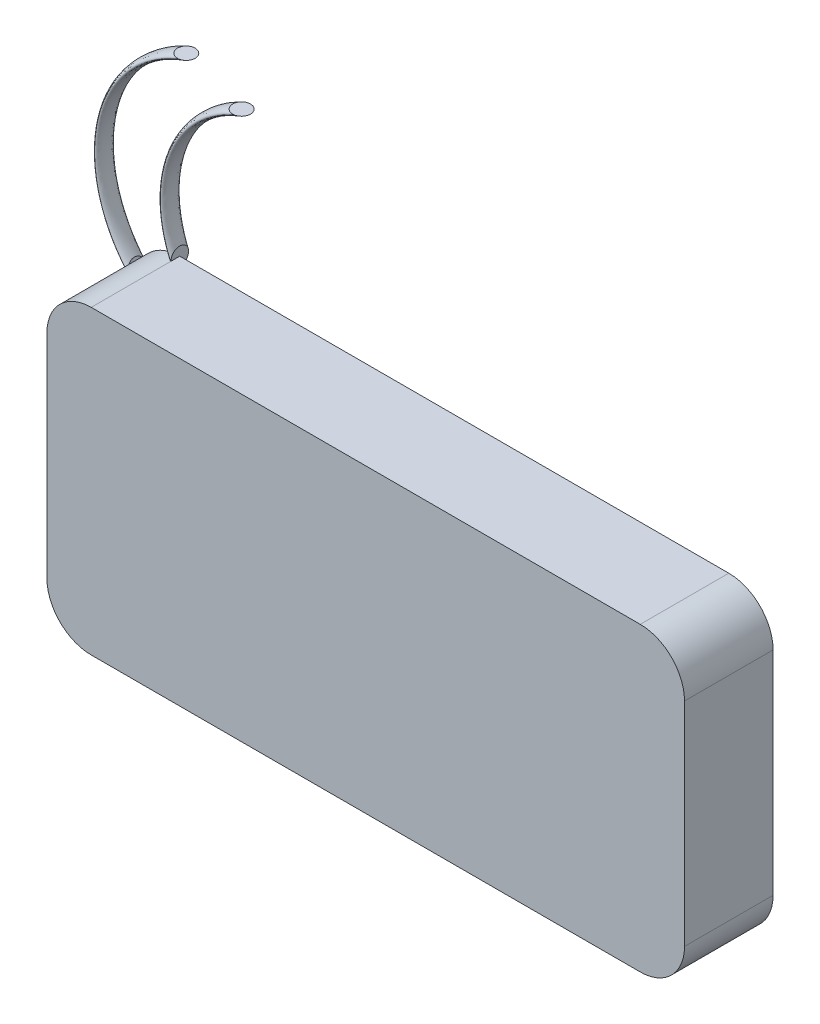
ISO-10303-21;
HEADER;
FILE_DESCRIPTION(('STEP AP214'),'2;1');
FILE_NAME('part.step','',(''),(''),'','','');
FILE_SCHEMA(('AUTOMOTIVE_DESIGN { 1 0 10303 214 1 1 1 1 }'));
ENDSEC;
DATA;
#1=APPLICATION_CONTEXT('core data for automotive mechanical design processes');
#2=APPLICATION_PROTOCOL_DEFINITION('international standard','automotive_design',2000,#1);
#3=PRODUCT_CONTEXT('',#1,'mechanical');
#4=PRODUCT('Part','Part','',(#3));
#5=PRODUCT_RELATED_PRODUCT_CATEGORY('part','',(#4));
#6=PRODUCT_DEFINITION_FORMATION('','',#4);
#7=PRODUCT_DEFINITION_CONTEXT('part definition',#1,'design');
#8=PRODUCT_DEFINITION('design','',#6,#7);
#9=PRODUCT_DEFINITION_SHAPE('','',#8);
#10=(LENGTH_UNIT() NAMED_UNIT(*) SI_UNIT(.MILLI.,.METRE.));
#11=(NAMED_UNIT(*) PLANE_ANGLE_UNIT() SI_UNIT($,.RADIAN.));
#12=(NAMED_UNIT(*) SI_UNIT($,.STERADIAN.) SOLID_ANGLE_UNIT());
#13=UNCERTAINTY_MEASURE_WITH_UNIT(LENGTH_MEASURE(1.E-05),#10,'distance_accuracy_value','');
#14=(GEOMETRIC_REPRESENTATION_CONTEXT(3) GLOBAL_UNCERTAINTY_ASSIGNED_CONTEXT((#13)) GLOBAL_UNIT_ASSIGNED_CONTEXT((#10,
#11,#12)) REPRESENTATION_CONTEXT('',''));
#15=CARTESIAN_POINT('',(0.,0.,0.));
#16=DIRECTION('',(0.,0.,1.));
#17=DIRECTION('',(1.,0.,0.));
#18=AXIS2_PLACEMENT_3D('',#15,#16,#17);
#19=CARTESIAN_POINT('',(67.,5.,0.));
#20=DIRECTION('',(0.,0.,1.));
#21=DIRECTION('',(1.,0.,0.));
#22=AXIS2_PLACEMENT_3D('',#19,#20,#21);
#23=PLANE('',#22);
#24=DIRECTION('',(0.,-1.,0.));
#25=VECTOR('',#24,1.);
#26=CARTESIAN_POINT('',(4.99999999999998,5.0000000000001,0.));
#27=LINE('',#26,#25);
#28=CARTESIAN_POINT('',(5.00000000000002,34.,0.));
#29=VERTEX_POINT('',#28);
#30=CARTESIAN_POINT('',(5.00000000000003,33.0008996980429,0.));
#31=VERTEX_POINT('',#30);
#32=EDGE_CURVE('E128',#29,#31,#27,.T.);
#33=ORIENTED_EDGE('',*,*,#32,.F.);
#34=DIRECTION('',(-1.,0.,0.));
#35=VECTOR('',#34,1.);
#36=CARTESIAN_POINT('',(5.00000000000004,34.,0.));
#37=LINE('',#36,#35);
#38=CARTESIAN_POINT('',(67.,34.,0.));
#39=VERTEX_POINT('',#38);
#40=EDGE_CURVE('E218',#39,#29,#37,.T.);
#41=ORIENTED_EDGE('',*,*,#40,.F.);
#42=CARTESIAN_POINT('',(67.,29.,0.));
#43=DIRECTION('',(0.,0.,1.));
#44=DIRECTION('',(-1.,0.,0.));
#45=AXIS2_PLACEMENT_3D('',#42,#43,#44);
#46=CIRCLE('',#45,5.);
#47=CARTESIAN_POINT('',(72.,29.,0.));
#48=VERTEX_POINT('',#47);
#49=EDGE_CURVE('E216',#48,#39,#46,.T.);
#50=ORIENTED_EDGE('',*,*,#49,.F.);
#51=DIRECTION('',(0.,1.,0.));
#52=VECTOR('',#51,1.);
#53=CARTESIAN_POINT('',(72.,5.00000000000004,0.));
#54=LINE('',#53,#52);
#55=CARTESIAN_POINT('',(72.,5.00000000000004,0.));
#56=VERTEX_POINT('',#55);
#57=EDGE_CURVE('E214',#56,#48,#54,.T.);
#58=ORIENTED_EDGE('',*,*,#57,.F.);
#59=CARTESIAN_POINT('',(67.,5.,0.));
#60=DIRECTION('',(0.,0.,1.));
#61=DIRECTION('',(1.,0.,0.));
#62=AXIS2_PLACEMENT_3D('',#59,#60,#61);
#63=CIRCLE('',#62,5.);
#64=CARTESIAN_POINT('',(67.,0.,0.));
#65=VERTEX_POINT('',#64);
#66=EDGE_CURVE('E192',#65,#56,#63,.T.);
#67=ORIENTED_EDGE('',*,*,#66,.F.);
#68=DIRECTION('',(1.,0.,0.));
#69=VECTOR('',#68,1.);
#70=CARTESIAN_POINT('',(5.00000000000004,0.,0.));
#71=LINE('',#70,#69);
#72=CARTESIAN_POINT('',(5.00000000000004,0.,0.));
#73=VERTEX_POINT('',#72);
#74=EDGE_CURVE('E197',#73,#65,#71,.T.);
#75=ORIENTED_EDGE('',*,*,#74,.F.);
#76=CARTESIAN_POINT('',(5.,5.,0.));
#77=DIRECTION('',(0.,0.,1.));
#78=DIRECTION('',(-1.,0.,0.));
#79=AXIS2_PLACEMENT_3D('',#76,#77,#78);
#80=CIRCLE('',#79,5.);
#81=CARTESIAN_POINT('',(0.,5.,0.));
#82=VERTEX_POINT('',#81);
#83=EDGE_CURVE('E225',#82,#73,#80,.T.);
#84=ORIENTED_EDGE('',*,*,#83,.F.);
#85=DIRECTION('',(0.,-1.,0.));
#86=VECTOR('',#85,1.);
#87=CARTESIAN_POINT('',(0.,5.00000000000004,0.));
#88=LINE('',#87,#86);
#89=CARTESIAN_POINT('',(0.,29.,0.));
#90=VERTEX_POINT('',#89);
#91=EDGE_CURVE('E223',#90,#82,#88,.T.);
#92=ORIENTED_EDGE('',*,*,#91,.F.);
#93=CARTESIAN_POINT('',(5.,29.,0.));
#94=DIRECTION('',(0.,0.,1.));
#95=DIRECTION('',(-1.,0.,0.));
#96=AXIS2_PLACEMENT_3D('',#93,#94,#95);
#97=CIRCLE('',#96,5.);
#98=CARTESIAN_POINT('',(0.0884421930118107,29.936269143256,0.));
#99=VERTEX_POINT('',#98);
#100=EDGE_CURVE('E220',#99,#90,#97,.T.);
#101=ORIENTED_EDGE('',*,*,#100,.F.);
#102=CARTESIAN_POINT('',(11.4249652949208,40.3526080949867,0.));
#103=DIRECTION('',(0.,0.,-1.));
#104=DIRECTION('',(-1.,0.,0.));
#105=AXIS2_PLACEMENT_3D('',#102,#103,#104);
#106=CIRCLE('',#105,15.395352324564);
#107=CARTESIAN_POINT('',(0.536435096106281,29.4688227559164,0.));
#108=VERTEX_POINT('',#107);
#109=EDGE_CURVE('E251',#99,#108,#106,.F.);
#110=ORIENTED_EDGE('',*,*,#109,.T.);
#111=DIRECTION('',(0.329385674954693,-0.944195465533828,0.));
#112=VECTOR('',#111,1.);
#113=CARTESIAN_POINT('',(15.357307468977,-13.0157221218928,0.));
#114=LINE('',#113,#112);
#115=CARTESIAN_POINT('',(0.205298062716035,30.4180385511704,0.));
#116=VERTEX_POINT('',#115);
#117=EDGE_CURVE('E42',#116,#108,#114,.T.);
#118=ORIENTED_EDGE('',*,*,#117,.F.);
#119=CARTESIAN_POINT('',(4.53985029390734,33.9787812010554,0.));
#120=VERTEX_POINT('',#119);
#121=EDGE_CURVE('E221',#120,#116,#97,.T.);
#122=ORIENTED_EDGE('',*,*,#121,.F.);
#123=CARTESIAN_POINT('',(17.4354198997295,39.4496869852021,0.));
#124=DIRECTION('',(0.,0.,-1.));
#125=DIRECTION('',(-1.,0.,0.));
#126=AXIS2_PLACEMENT_3D('',#123,#124,#125);
#127=CIRCLE('',#126,14.0080878622892);
#128=EDGE_CURVE('E11',#120,#31,#127,.F.);
#129=ORIENTED_EDGE('',*,*,#128,.T.);
#130=EDGE_LOOP('',(#33,#41,#50,#58,#67,#75,#84,#92,#101,#110,#118,#122,#129));
#131=FACE_BOUND('',#130,.T.);
#132=ADVANCED_FACE('F34',(#131),#23,.F.);
#133=CARTESIAN_POINT('',(5.,29.,10.));
#134=DIRECTION('',(0.,0.,-1.));
#135=DIRECTION('',(-1.,0.,0.));
#136=AXIS2_PLACEMENT_3D('',#133,#134,#135);
#137=CYLINDRICAL_SURFACE('',#136,5.);
#138=DIRECTION('',(0.,0.,-1.));
#139=VECTOR('',#138,1.);
#140=CARTESIAN_POINT('',(5.00000000000004,34.,10.));
#141=LINE('',#140,#139);
#142=CARTESIAN_POINT('',(5.00000000000004,34.,10.));
#143=VERTEX_POINT('',#142);
#144=CARTESIAN_POINT('',(5.00000000000004,34.,0.999100301957087));
#145=VERTEX_POINT('',#144);
#146=EDGE_CURVE('E240',#143,#145,#141,.T.);
#147=ORIENTED_EDGE('',*,*,#146,.T.);
#148=CARTESIAN_POINT('',(5.00000000000003,34.,0.999100301957087));
#149=CARTESIAN_POINT('',(4.98607693705951,34.0000021979118,0.999142509095301));
#150=CARTESIAN_POINT('',(4.9722461072335,33.9999419381843,0.997587468870882));
#151=CARTESIAN_POINT('',(4.94530139066627,33.9997181434536,0.991826125624204));
#152=CARTESIAN_POINT('',(4.93218108586637,33.9995558046997,0.987650533549538));
#153=CARTESIAN_POINT('',(4.90457269351783,33.999111950049,0.976225251962453));
#154=CARTESIAN_POINT('',(4.89026353443802,33.9988142414723,0.968557499354267));
#155=CARTESIAN_POINT('',(4.86295259517132,33.9981401808719,0.951065986251289));
#156=CARTESIAN_POINT('',(4.8499595948591,33.9977633464463,0.941228981222202));
#157=CARTESIAN_POINT('',(4.81662993085964,33.9966808571331,0.912633323827443));
#158=CARTESIAN_POINT('',(4.79752769111054,33.9959298311245,0.892453417487748));
#159=CARTESIAN_POINT('',(4.76241789375922,33.9943830822246,0.849618542609901));
#160=CARTESIAN_POINT('',(4.7464159572,33.9935872814618,0.826959192906528));
#161=CARTESIAN_POINT('',(4.7170189534145,33.9920072388262,0.780237358050385));
#162=CARTESIAN_POINT('',(4.70360732091259,33.9912229553052,0.756185161141288));
#163=CARTESIAN_POINT('',(4.67884413056725,33.9896905195244,0.707033482740123));
#164=CARTESIAN_POINT('',(4.66749452976227,33.9889424020783,0.681933033864363));
#165=CARTESIAN_POINT('',(4.63607037935507,33.9867829615147,0.605506452006262));
#166=CARTESIAN_POINT('',(4.61863819630192,33.9854576062808,0.553085485135301));
#167=CARTESIAN_POINT('',(4.59295722807165,33.983415723985,0.459690693614689));
#168=CARTESIAN_POINT('',(4.58350638317862,33.982629505088,0.41902761991427));
#169=CARTESIAN_POINT('',(4.56748772421334,33.9812647635938,0.337121149308805));
#170=CARTESIAN_POINT('',(4.56092052753164,33.9806862854789,0.295877630078912));
#171=CARTESIAN_POINT('',(4.5503546227513,33.9797438350477,0.212305281396447));
#172=CARTESIAN_POINT('',(4.54640479692173,33.9793839550344,0.169970354950818));
#173=CARTESIAN_POINT('',(4.54115874756467,33.9789020270681,0.0850885473157945));
#174=CARTESIAN_POINT('',(4.53986535632076,33.9787802329684,0.0425414883333917));
#175=CARTESIAN_POINT('',(4.53985029390735,33.9787812010554,0.));
#176=B_SPLINE_CURVE_WITH_KNOTS('',3,(#148,#149,#150,#151,#152,#153,#154,#155,#156,#157,#158,
#159,#160,#161,#162,#163,#164,#165,#166,#167,#168,#169,#170,#171,#172,#173,#174,#175),
.UNSPECIFIED.,.F.,.F.,(4,2,2,2,2,2,2,2,2,2,2,2,2,4),(0.,0.0415393318644265,0.0826007176007306,
0.131053538073427,0.179810811838929,0.262735983320194,0.345810124517231,0.428334000080407,
0.510935793076548,0.676243982118326,0.801417648472979,0.926618101522078,1.05409543943348,
1.18170862293958),.UNSPECIFIED.);
#177=EDGE_CURVE('E55',#145,#120,#176,.T.);
#178=ORIENTED_EDGE('',*,*,#177,.T.);
#179=ORIENTED_EDGE('',*,*,#121,.T.);
#180=DIRECTION('',(0.,0.,-1.));
#181=VECTOR('',#180,1.);
#182=CARTESIAN_POINT('',(0.205298062716033,30.4180385511704,10.));
#183=LINE('',#182,#181);
#184=CARTESIAN_POINT('',(0.205298062716034,30.4180385511704,0.999985864416658));
#185=VERTEX_POINT('',#184);
#186=EDGE_CURVE('E188',#185,#116,#183,.T.);
#187=ORIENTED_EDGE('',*,*,#186,.F.);
#188=CARTESIAN_POINT('',(0.205298062716034,30.4180385511704,0.999985864416658));
#189=CARTESIAN_POINT('',(0.201800323069069,30.406216699392,1.00015543326696));
#190=CARTESIAN_POINT('',(0.198360006613919,30.3944188532153,0.99913881190872));
#191=CARTESIAN_POINT('',(0.19169597642804,30.3712593811186,0.995076103396521));
#192=CARTESIAN_POINT('',(0.188470213695762,30.3598942833473,0.992053684921513));
#193=CARTESIAN_POINT('',(0.181178821143054,30.3338683518481,0.982973485351146));
#194=CARTESIAN_POINT('',(0.177208181074048,30.3194258362253,0.976227702645713));
#195=CARTESIAN_POINT('',(0.169696566450536,30.2916567086538,0.960456663808333));
#196=CARTESIAN_POINT('',(0.166158206369834,30.2783370246905,0.951418465303915));
#197=CARTESIAN_POINT('',(0.157277724735583,30.2443968367932,0.925168758612041));
#198=CARTESIAN_POINT('',(0.152299406338456,30.224806393504,0.90651699995717));
#199=CARTESIAN_POINT('',(0.143248236628929,30.1884081532512,0.866531781949044));
#200=CARTESIAN_POINT('',(0.139177073865918,30.1716055600972,0.84519343547471));
#201=CARTESIAN_POINT('',(0.131924248943343,30.1410836107701,0.801829562166138));
#202=CARTESIAN_POINT('',(0.128709497724821,30.1272556426633,0.779884947157588));
#203=CARTESIAN_POINT('',(0.122804788425935,30.1014269923445,0.734869425856259));
#204=CARTESIAN_POINT('',(0.120115305968979,30.0894279683537,0.711797522231154));
#205=CARTESIAN_POINT('',(0.112694703125694,30.0558315576542,0.641328629713969));
#206=CARTESIAN_POINT('',(0.108615273446885,30.0366514279931,0.592703611949023));
#207=CARTESIAN_POINT('',(0.102198986942487,30.0058591318511,0.500156799078394));
#208=CARTESIAN_POINT('',(0.0997036460048645,29.9935839045421,0.456455900080183));
#209=CARTESIAN_POINT('',(0.0955216663247193,29.9727307509741,0.368211520459611));
#210=CARTESIAN_POINT('',(0.0938338461140916,29.9641474250347,0.323669370524737));
#211=CARTESIAN_POINT('',(0.0911166732861291,29.9502203210285,0.232766050672841));
#212=CARTESIAN_POINT('',(0.0901075136619822,29.9449761172663,0.18638927144711));
#213=CARTESIAN_POINT('',(0.0887738557529616,29.9380079063555,0.0933385578658275));
#214=CARTESIAN_POINT('',(0.0884496777452376,29.9362855459288,0.0466644947345476));
#215=CARTESIAN_POINT('',(0.0884421930118176,29.936269143256,2.93266029395825E-12));
#216=B_SPLINE_CURVE_WITH_KNOTS('',3,(#188,#189,#190,#191,#192,#193,#194,#195,#196,#197,#198,
#199,#200,#201,#202,#203,#204,#205,#206,#207,#208,#209,#210,#211,#212,#213,#214,#215),
.UNSPECIFIED.,.F.,.F.,(4,2,2,2,2,2,2,2,2,2,2,2,2,4),(0.,0.0368508597721053,0.0732744276436689,
0.122285057488083,0.17157879917652,0.253628291621686,0.335829255641276,0.414121855998176,
0.492485023818365,0.649301587188467,0.785525238998852,0.921548970447638,1.06145942233062,
1.20143527774106),.UNSPECIFIED.);
#217=EDGE_CURVE('E181',#185,#99,#216,.T.);
#218=ORIENTED_EDGE('',*,*,#217,.T.);
#219=ORIENTED_EDGE('',*,*,#100,.T.);
#220=DIRECTION('',(0.,0.,-1.));
#221=VECTOR('',#220,1.);
#222=CARTESIAN_POINT('',(0.,29.,10.));
#223=LINE('',#222,#221);
#224=CARTESIAN_POINT('',(0.,29.,10.));
#225=VERTEX_POINT('',#224);
#226=EDGE_CURVE('E236',#225,#90,#223,.T.);
#227=ORIENTED_EDGE('',*,*,#226,.F.);
#228=CARTESIAN_POINT('',(5.,29.,10.));
#229=DIRECTION('',(0.,0.,1.));
#230=DIRECTION('',(-1.,0.,0.));
#231=AXIS2_PLACEMENT_3D('',#228,#229,#230);
#232=CIRCLE('',#231,5.);
#233=EDGE_CURVE('E203',#143,#225,#232,.T.);
#234=ORIENTED_EDGE('',*,*,#233,.F.);
#235=EDGE_LOOP('',(#147,#178,#179,#187,#218,#219,#227,#234));
#236=FACE_BOUND('',#235,.T.);
#237=ADVANCED_FACE('F144',(#236),#137,.T.);
#238=CARTESIAN_POINT('',(67.,5.,10.));
#239=DIRECTION('',(0.,0.,-1.));
#240=DIRECTION('',(-1.,0.,0.));
#241=AXIS2_PLACEMENT_3D('',#238,#239,#240);
#242=CYLINDRICAL_SURFACE('',#241,5.);
#243=ORIENTED_EDGE('',*,*,#66,.T.);
#244=DIRECTION('',(0.,0.,-1.));
#245=VECTOR('',#244,1.);
#246=CARTESIAN_POINT('',(72.,5.00000000000004,10.));
#247=LINE('',#246,#245);
#248=CARTESIAN_POINT('',(72.,5.00000000000004,10.));
#249=VERTEX_POINT('',#248);
#250=EDGE_CURVE('E248',#249,#56,#247,.T.);
#251=ORIENTED_EDGE('',*,*,#250,.F.);
#252=CARTESIAN_POINT('',(67.,5.,10.));
#253=DIRECTION('',(0.,0.,1.));
#254=DIRECTION('',(1.,0.,0.));
#255=AXIS2_PLACEMENT_3D('',#252,#253,#254);
#256=CIRCLE('',#255,5.);
#257=CARTESIAN_POINT('',(67.,0.,10.));
#258=VERTEX_POINT('',#257);
#259=EDGE_CURVE('E193',#258,#249,#256,.T.);
#260=ORIENTED_EDGE('',*,*,#259,.F.);
#261=DIRECTION('',(0.,0.,-1.));
#262=VECTOR('',#261,1.);
#263=CARTESIAN_POINT('',(67.,0.,10.));
#264=LINE('',#263,#262);
#265=EDGE_CURVE('E211',#258,#65,#264,.T.);
#266=ORIENTED_EDGE('',*,*,#265,.T.);
#267=EDGE_LOOP('',(#243,#251,#260,#266));
#268=FACE_BOUND('',#267,.T.);
#269=ADVANCED_FACE('F36',(#268),#242,.T.);
#270=CARTESIAN_POINT('',(72.,5.00000000000004,10.));
#271=DIRECTION('',(-1.,0.,0.));
#272=DIRECTION('',(0.,0.,1.));
#273=AXIS2_PLACEMENT_3D('',#270,#271,#272);
#274=PLANE('',#273);
#275=ORIENTED_EDGE('',*,*,#57,.T.);
#276=DIRECTION('',(0.,0.,-1.));
#277=VECTOR('',#276,1.);
#278=CARTESIAN_POINT('',(72.,29.,10.));
#279=LINE('',#278,#277);
#280=CARTESIAN_POINT('',(72.,29.,10.));
#281=VERTEX_POINT('',#280);
#282=EDGE_CURVE('E245',#281,#48,#279,.T.);
#283=ORIENTED_EDGE('',*,*,#282,.F.);
#284=DIRECTION('',(0.,1.,0.));
#285=VECTOR('',#284,1.);
#286=CARTESIAN_POINT('',(72.,5.00000000000004,10.));
#287=LINE('',#286,#285);
#288=EDGE_CURVE('E196',#249,#281,#287,.T.);
#289=ORIENTED_EDGE('',*,*,#288,.F.);
#290=ORIENTED_EDGE('',*,*,#250,.T.);
#291=EDGE_LOOP('',(#275,#283,#289,#290));
#292=FACE_BOUND('',#291,.T.);
#293=ADVANCED_FACE('F277',(#292),#274,.F.);
#294=CARTESIAN_POINT('',(67.,29.,10.));
#295=DIRECTION('',(0.,0.,-1.));
#296=DIRECTION('',(-1.,0.,0.));
#297=AXIS2_PLACEMENT_3D('',#294,#295,#296);
#298=CYLINDRICAL_SURFACE('',#297,5.);
#299=ORIENTED_EDGE('',*,*,#49,.T.);
#300=DIRECTION('',(0.,0.,-1.));
#301=VECTOR('',#300,1.);
#302=CARTESIAN_POINT('',(67.,34.,10.));
#303=LINE('',#302,#301);
#304=CARTESIAN_POINT('',(67.,34.,10.));
#305=VERTEX_POINT('',#304);
#306=EDGE_CURVE('E242',#305,#39,#303,.T.);
#307=ORIENTED_EDGE('',*,*,#306,.F.);
#308=CARTESIAN_POINT('',(67.,29.,10.));
#309=DIRECTION('',(0.,0.,1.));
#310=DIRECTION('',(-1.,0.,0.));
#311=AXIS2_PLACEMENT_3D('',#308,#309,#310);
#312=CIRCLE('',#311,5.);
#313=EDGE_CURVE('E199',#281,#305,#312,.T.);
#314=ORIENTED_EDGE('',*,*,#313,.F.);
#315=ORIENTED_EDGE('',*,*,#282,.T.);
#316=EDGE_LOOP('',(#299,#307,#314,#315));
#317=FACE_BOUND('',#316,.T.);
#318=ADVANCED_FACE('F274',(#317),#298,.T.);
#319=CARTESIAN_POINT('',(5.00000000000004,34.,10.));
#320=DIRECTION('',(0.,-1.,0.));
#321=DIRECTION('',(0.,0.,-1.));
#322=AXIS2_PLACEMENT_3D('',#319,#320,#321);
#323=PLANE('',#322);
#324=ORIENTED_EDGE('',*,*,#40,.T.);
#325=EDGE_CURVE('E239',#145,#29,#141,.T.);
#326=ORIENTED_EDGE('',*,*,#325,.F.);
#327=ORIENTED_EDGE('',*,*,#146,.F.);
#328=DIRECTION('',(-1.,0.,0.));
#329=VECTOR('',#328,1.);
#330=CARTESIAN_POINT('',(5.00000000000004,34.,10.));
#331=LINE('',#330,#329);
#332=EDGE_CURVE('E201',#305,#143,#331,.T.);
#333=ORIENTED_EDGE('',*,*,#332,.F.);
#334=ORIENTED_EDGE('',*,*,#306,.T.);
#335=EDGE_LOOP('',(#324,#326,#327,#333,#334));
#336=FACE_BOUND('',#335,.T.);
#337=ADVANCED_FACE('F268',(#336),#323,.F.);
#338=CARTESIAN_POINT('',(0.,5.00000000000004,10.));
#339=DIRECTION('',(1.,0.,0.));
#340=DIRECTION('',(0.,0.,-1.));
#341=AXIS2_PLACEMENT_3D('',#338,#339,#340);
#342=PLANE('',#341);
#343=ORIENTED_EDGE('',*,*,#91,.T.);
#344=DIRECTION('',(0.,0.,-1.));
#345=VECTOR('',#344,1.);
#346=CARTESIAN_POINT('',(0.,5.,10.));
#347=LINE('',#346,#345);
#348=CARTESIAN_POINT('',(0.,5.,10.));
#349=VERTEX_POINT('',#348);
#350=EDGE_CURVE('E233',#349,#82,#347,.T.);
#351=ORIENTED_EDGE('',*,*,#350,.F.);
#352=DIRECTION('',(0.,-1.,0.));
#353=VECTOR('',#352,1.);
#354=CARTESIAN_POINT('',(0.,5.00000000000004,10.));
#355=LINE('',#354,#353);
#356=EDGE_CURVE('E205',#225,#349,#355,.T.);
#357=ORIENTED_EDGE('',*,*,#356,.F.);
#358=ORIENTED_EDGE('',*,*,#226,.T.);
#359=EDGE_LOOP('',(#343,#351,#357,#358));
#360=FACE_BOUND('',#359,.T.);
#361=ADVANCED_FACE('F294',(#360),#342,.F.);
#362=CARTESIAN_POINT('',(5.,5.,10.));
#363=DIRECTION('',(0.,0.,-1.));
#364=DIRECTION('',(-1.,0.,0.));
#365=AXIS2_PLACEMENT_3D('',#362,#363,#364);
#366=CYLINDRICAL_SURFACE('',#365,5.);
#367=ORIENTED_EDGE('',*,*,#83,.T.);
#368=DIRECTION('',(0.,0.,-1.));
#369=VECTOR('',#368,1.);
#370=CARTESIAN_POINT('',(5.00000000000004,0.,10.));
#371=LINE('',#370,#369);
#372=CARTESIAN_POINT('',(5.00000000000004,0.,10.));
#373=VERTEX_POINT('',#372);
#374=EDGE_CURVE('E230',#373,#73,#371,.T.);
#375=ORIENTED_EDGE('',*,*,#374,.F.);
#376=CARTESIAN_POINT('',(5.,5.,10.));
#377=DIRECTION('',(0.,0.,1.));
#378=DIRECTION('',(-1.,0.,0.));
#379=AXIS2_PLACEMENT_3D('',#376,#377,#378);
#380=CIRCLE('',#379,5.);
#381=EDGE_CURVE('E207',#349,#373,#380,.T.);
#382=ORIENTED_EDGE('',*,*,#381,.F.);
#383=ORIENTED_EDGE('',*,*,#350,.T.);
#384=EDGE_LOOP('',(#367,#375,#382,#383));
#385=FACE_BOUND('',#384,.T.);
#386=ADVANCED_FACE('F291',(#385),#366,.T.);
#387=CARTESIAN_POINT('',(5.00000000000004,0.,10.));
#388=DIRECTION('',(0.,1.,0.));
#389=DIRECTION('',(0.,0.,1.));
#390=AXIS2_PLACEMENT_3D('',#387,#388,#389);
#391=PLANE('',#390);
#392=ORIENTED_EDGE('',*,*,#74,.T.);
#393=ORIENTED_EDGE('',*,*,#265,.F.);
#394=DIRECTION('',(1.,0.,0.));
#395=VECTOR('',#394,1.);
#396=CARTESIAN_POINT('',(5.00000000000004,0.,10.));
#397=LINE('',#396,#395);
#398=EDGE_CURVE('E209',#373,#258,#397,.T.);
#399=ORIENTED_EDGE('',*,*,#398,.F.);
#400=ORIENTED_EDGE('',*,*,#374,.T.);
#401=EDGE_LOOP('',(#392,#393,#399,#400));
#402=FACE_BOUND('',#401,.T.);
#403=ADVANCED_FACE('F287',(#402),#391,.F.);
#404=CARTESIAN_POINT('',(67.,5.,10.));
#405=DIRECTION('',(0.,0.,1.));
#406=DIRECTION('',(1.,0.,0.));
#407=AXIS2_PLACEMENT_3D('',#404,#405,#406);
#408=PLANE('',#407);
#409=ORIENTED_EDGE('',*,*,#259,.T.);
#410=ORIENTED_EDGE('',*,*,#288,.T.);
#411=ORIENTED_EDGE('',*,*,#313,.T.);
#412=ORIENTED_EDGE('',*,*,#332,.T.);
#413=ORIENTED_EDGE('',*,*,#233,.T.);
#414=ORIENTED_EDGE('',*,*,#356,.T.);
#415=ORIENTED_EDGE('',*,*,#381,.T.);
#416=ORIENTED_EDGE('',*,*,#398,.T.);
#417=EDGE_LOOP('',(#409,#410,#411,#412,#413,#414,#415,#416));
#418=FACE_BOUND('',#417,.T.);
#419=ADVANCED_FACE('F298',(#418),#408,.T.);
#420=CARTESIAN_POINT('',(0.207049421151587,30.4130182214502,0.));
#421=DIRECTION('',(-0.944195465533828,-0.329385674954693,0.));
#422=DIRECTION('',(0.,0.,1.));
#423=AXIS2_PLACEMENT_3D('',#420,#421,#422);
#424=PLANE('',#423);
#425=CARTESIAN_POINT('',(0.207049421151587,30.4130182214502,0.));
#426=DIRECTION('',(-0.944195465533828,-0.329385674954693,0.));
#427=DIRECTION('',(0.,0.,1.));
#428=AXIS2_PLACEMENT_3D('',#425,#426,#427);
#429=CIRCLE('',#428,1.);
#430=EDGE_CURVE('E142',#185,#108,#429,.T.);
#431=ORIENTED_EDGE('',*,*,#430,.F.);
#432=ORIENTED_EDGE('',*,*,#186,.T.);
#433=ORIENTED_EDGE('',*,*,#117,.T.);
#434=EDGE_LOOP('',(#431,#432,#433));
#435=FACE_BOUND('',#434,.T.);
#436=ADVANCED_FACE('F172',(#435),#424,.F.);
#437=CARTESIAN_POINT('',(0.207049421151587,30.4130182214502,1.));
#438=CARTESIAN_POINT('',(-7.30285698852021,38.8887701785684,1.));
#439=CARTESIAN_POINT('',(-4.74135175776854,49.9194436155556,1.));
#440=CARTESIAN_POINT('',(5.73507039872823,54.2184719150072,1.));
#441=CARTESIAN_POINT('',(-0.451721928757802,32.3014091525179,1.));
#442=CARTESIAN_POINT('',(-6.5348452077746,41.274899069264,1.));
#443=CARTESIAN_POINT('',(-2.74135175776855,51.4305535316028,1.));
#444=CARTESIAN_POINT('',(7.73507039872823,54.2184719150072,1.));
#445=CARTESIAN_POINT('',(-0.451721928757802,32.3014091525179,-1.));
#446=CARTESIAN_POINT('',(-6.5348452077746,41.274899069264,-1.));
#447=CARTESIAN_POINT('',(-2.74135175776855,51.4305535316028,-1.));
#448=CARTESIAN_POINT('',(7.73507039872823,54.2184719150072,-1.));
#449=CARTESIAN_POINT('',(0.207049421151587,30.4130182214502,-1.));
#450=CARTESIAN_POINT('',(-7.30285698852021,38.8887701785684,-1.));
#451=CARTESIAN_POINT('',(-4.74135175776854,49.9194436155556,-1.));
#452=CARTESIAN_POINT('',(5.73507039872823,54.2184719150072,-1.));
#453=CARTESIAN_POINT('',(0.865820771060975,28.5246272903826,-1.));
#454=CARTESIAN_POINT('',(-8.07086876926582,36.5026412878728,-1.));
#455=CARTESIAN_POINT('',(-6.74135175776855,48.4083336995083,-1.));
#456=CARTESIAN_POINT('',(3.73507039872823,54.2184719150072,-1.));
#457=CARTESIAN_POINT('',(0.865820771060975,28.5246272903826,1.));
#458=CARTESIAN_POINT('',(-8.07086876926582,36.5026412878728,1.));
#459=CARTESIAN_POINT('',(-6.74135175776855,48.4083336995083,1.));
#460=CARTESIAN_POINT('',(3.73507039872823,54.2184719150072,1.));
#461=CARTESIAN_POINT('',(0.207049421151587,30.4130182214502,1.));
#462=CARTESIAN_POINT('',(-7.30285698852021,38.8887701785684,1.));
#463=CARTESIAN_POINT('',(-4.74135175776854,49.9194436155556,1.));
#464=CARTESIAN_POINT('',(5.73507039872823,54.2184719150072,1.));
#465=(BOUNDED_SURFACE() B_SPLINE_SURFACE(3,3,((#437,#438,#439,#440),(#441,#442,#443,#444),(#445,
#446,#447,#448),(#449,#450,#451,#452),(#453,#454,#455,#456),(#457,#458,#459,#460),(#461,#462,
#463,#464)),.UNSPECIFIED.,.T.,.F.,.F.) B_SPLINE_SURFACE_WITH_KNOTS((4,3,4),(4,4),(0.,0.5,1.),
(0.,1.),.UNSPECIFIED.) GEOMETRIC_REPRESENTATION_ITEM() RATIONAL_B_SPLINE_SURFACE(((1.,
0.719371421565083,0.719371421565083,1.),(0.333333333333333,0.239790473855028,0.239790473855028,
0.333333333333333),(0.333333333333333,0.239790473855028,0.239790473855028,0.333333333333333),
(1.,0.719371421565083,0.719371421565083,1.),(0.333333333333333,0.239790473855028,
0.239790473855028,0.333333333333333),(0.333333333333333,0.239790473855028,0.239790473855028,
0.333333333333333),(1.,0.719371421565083,0.719371421565083,1.))) REPRESENTATION_ITEM('') SURFACE());
#466=CARTESIAN_POINT('',(5.73507039872823,54.2184719150072,0.));
#467=DIRECTION('',(0.,1.,0.));
#468=DIRECTION('',(0.,0.,1.));
#469=AXIS2_PLACEMENT_3D('',#466,#467,#468);
#470=CIRCLE('',#469,1.);
#471=CARTESIAN_POINT('',(5.73507039872823,54.2184719150072,1.));
#472=VERTEX_POINT('',#471);
#473=EDGE_CURVE('E189',#472,#472,#470,.T.);
#474=ORIENTED_EDGE('',*,*,#473,.F.);
#475=EDGE_LOOP('',(#474));
#476=FACE_BOUND('',#475,.T.);
#477=ORIENTED_EDGE('',*,*,#217,.F.);
#478=ORIENTED_EDGE('',*,*,#430,.T.);
#479=ORIENTED_EDGE('',*,*,#109,.F.);
#480=EDGE_LOOP('',(#477,#478,#479));
#481=FACE_BOUND('',#480,.T.);
#482=ADVANCED_FACE('F166',(#476,#481),#465,.T.);
#483=CARTESIAN_POINT('',(5.73507039872823,54.2184719150072,0.));
#484=DIRECTION('',(0.,1.,0.));
#485=DIRECTION('',(0.,0.,1.));
#486=AXIS2_PLACEMENT_3D('',#483,#484,#485);
#487=PLANE('',#486);
#488=ORIENTED_EDGE('',*,*,#473,.T.);
#489=EDGE_LOOP('',(#488));
#490=FACE_BOUND('',#489,.T.);
#491=ADVANCED_FACE('F155',(#490),#487,.T.);
#492=CARTESIAN_POINT('',(5.00000000000002,34.,0.999100301957087));
#493=CARTESIAN_POINT('',(1.8076472747568,41.2845003234572,0.999100301957087));
#494=CARTESIAN_POINT('',(4.70123259107018,48.6927541596883,0.999100301957087));
#495=CARTESIAN_POINT('',(11.9857329145274,51.8851068849315,0.999100301957087));
#496=CARTESIAN_POINT('',(5.00000000000003,35.9982006039142,0.999100301957087));
#497=CARTESIAN_POINT('',(2.97816608818762,43.2827009273714,0.999100301957087));
#498=CARTESIAN_POINT('',(6.69943319498435,49.8632729731191,0.999100301957087));
#499=CARTESIAN_POINT('',(13.9839335184416,51.8851068849315,0.999100301957087));
#500=CARTESIAN_POINT('',(5.00000000000003,35.9982006039142,-0.999100301957087));
#501=CARTESIAN_POINT('',(2.97816608818762,43.2827009273714,-0.999100301957087));
#502=CARTESIAN_POINT('',(6.69943319498435,49.8632729731191,-0.999100301957087));
#503=CARTESIAN_POINT('',(13.9839335184416,51.8851068849315,-0.999100301957087));
#504=CARTESIAN_POINT('',(5.00000000000002,34.,-0.999100301957087));
#505=CARTESIAN_POINT('',(1.8076472747568,41.2845003234572,-0.999100301957087));
#506=CARTESIAN_POINT('',(4.70123259107018,48.6927541596883,-0.999100301957087));
#507=CARTESIAN_POINT('',(11.9857329145274,51.8851068849315,-0.999100301957087));
#508=CARTESIAN_POINT('',(5.00000000000003,32.0017993960858,-0.999100301957087));
#509=CARTESIAN_POINT('',(0.637128461325996,39.2862997195431,-0.999100301957087));
#510=CARTESIAN_POINT('',(2.70303198715601,47.5222353462575,-0.999100301957087));
#511=CARTESIAN_POINT('',(9.98753231061324,51.8851068849315,-0.999100301957087));
#512=CARTESIAN_POINT('',(5.00000000000003,32.0017993960858,0.999100301957087));
#513=CARTESIAN_POINT('',(0.637128461325996,39.2862997195431,0.999100301957087));
#514=CARTESIAN_POINT('',(2.70303198715601,47.5222353462575,0.999100301957087));
#515=CARTESIAN_POINT('',(9.98753231061324,51.8851068849315,0.999100301957087));
#516=CARTESIAN_POINT('',(5.00000000000002,34.,0.999100301957087));
#517=CARTESIAN_POINT('',(1.8076472747568,41.2845003234572,0.999100301957087));
#518=CARTESIAN_POINT('',(4.70123259107018,48.6927541596883,0.999100301957087));
#519=CARTESIAN_POINT('',(11.9857329145274,51.8851068849315,0.999100301957087));
#520=(BOUNDED_SURFACE() B_SPLINE_SURFACE(3,3,((#492,#493,#494,#495),(#496,#497,#498,#499),(#500,
#501,#502,#503),(#504,#505,#506,#507),(#508,#509,#510,#511),(#512,#513,#514,#515),(#516,#517,
#518,#519)),.UNSPECIFIED.,.T.,.F.,.F.) B_SPLINE_SURFACE_WITH_KNOTS((4,3,4),(4,4),(0.,0.5,1.),
(0.,1.),.UNSPECIFIED.) GEOMETRIC_REPRESENTATION_ITEM() RATIONAL_B_SPLINE_SURFACE(((1.,
0.804737854124365,0.804737854124365,1.),(0.333333333333333,0.268245951374789,0.268245951374789,
0.333333333333333),(0.333333333333333,0.268245951374789,0.268245951374789,0.333333333333333),
(1.,0.804737854124365,0.804737854124365,1.),(0.333333333333333,0.268245951374789,
0.268245951374789,0.333333333333333),(0.333333333333333,0.268245951374789,0.268245951374789,
0.333333333333333),(1.,0.804737854124365,0.804737854124365,1.))) REPRESENTATION_ITEM('') SURFACE());
#521=CARTESIAN_POINT('',(11.9857329145274,51.8851068849315,0.));
#522=DIRECTION('',(0.,1.,0.));
#523=DIRECTION('',(0.,0.,1.));
#524=AXIS2_PLACEMENT_3D('',#521,#522,#523);
#525=CIRCLE('',#524,0.999100301957087);
#526=CARTESIAN_POINT('',(11.9857329145274,51.8851068849315,0.999100301957087));
#527=VERTEX_POINT('',#526);
#528=EDGE_CURVE('E125',#527,#527,#525,.T.);
#529=CARTESIAN_POINT('',(5.00000000000002,34.,0.));
#530=DIRECTION('',(-1.,0.,0.));
#531=DIRECTION('',(0.,0.,1.));
#532=AXIS2_PLACEMENT_3D('',#529,#530,#531);
#533=CIRCLE('',#532,0.999100301957087);
#534=EDGE_CURVE('E129',#145,#31,#533,.T.);
#535=ORIENTED_EDGE('',*,*,#528,.F.);
#536=EDGE_LOOP('',(#535));
#537=FACE_BOUND('',#536,.T.);
#538=ORIENTED_EDGE('',*,*,#177,.F.);
#539=ORIENTED_EDGE('',*,*,#534,.T.);
#540=ORIENTED_EDGE('',*,*,#128,.F.);
#541=EDGE_LOOP('',(#538,#539,#540));
#542=FACE_BOUND('',#541,.T.);
#543=ADVANCED_FACE('F148',(#537,#542),#520,.T.);
#544=CARTESIAN_POINT('',(5.00000000000002,34.,0.));
#545=DIRECTION('',(-1.,0.,0.));
#546=DIRECTION('',(0.,0.,1.));
#547=AXIS2_PLACEMENT_3D('',#544,#545,#546);
#548=PLANE('',#547);
#549=ORIENTED_EDGE('',*,*,#325,.T.);
#550=ORIENTED_EDGE('',*,*,#32,.T.);
#551=ORIENTED_EDGE('',*,*,#534,.F.);
#552=EDGE_LOOP('',(#549,#550,#551));
#553=FACE_BOUND('',#552,.T.);
#554=ADVANCED_FACE('F154',(#553),#548,.F.);
#555=CARTESIAN_POINT('',(11.9857329145274,51.8851068849315,0.));
#556=DIRECTION('',(0.,1.,0.));
#557=DIRECTION('',(0.,0.,1.));
#558=AXIS2_PLACEMENT_3D('',#555,#556,#557);
#559=PLANE('',#558);
#560=ORIENTED_EDGE('',*,*,#528,.T.);
#561=EDGE_LOOP('',(#560));
#562=FACE_BOUND('',#561,.T.);
#563=ADVANCED_FACE('F126',(#562),#559,.T.);
#564=CLOSED_SHELL('',(#132,#237,#269,#293,#318,#337,#361,#386,#403,#419,#436,#482,#491,#543,
#554,#563));
#565=MANIFOLD_SOLID_BREP('B2',#564);
#566=ADVANCED_BREP_SHAPE_REPRESENTATION('',(#18,#565),#14);
#567=SHAPE_DEFINITION_REPRESENTATION(#9,#566);
ENDSEC;
END-ISO-10303-21;
